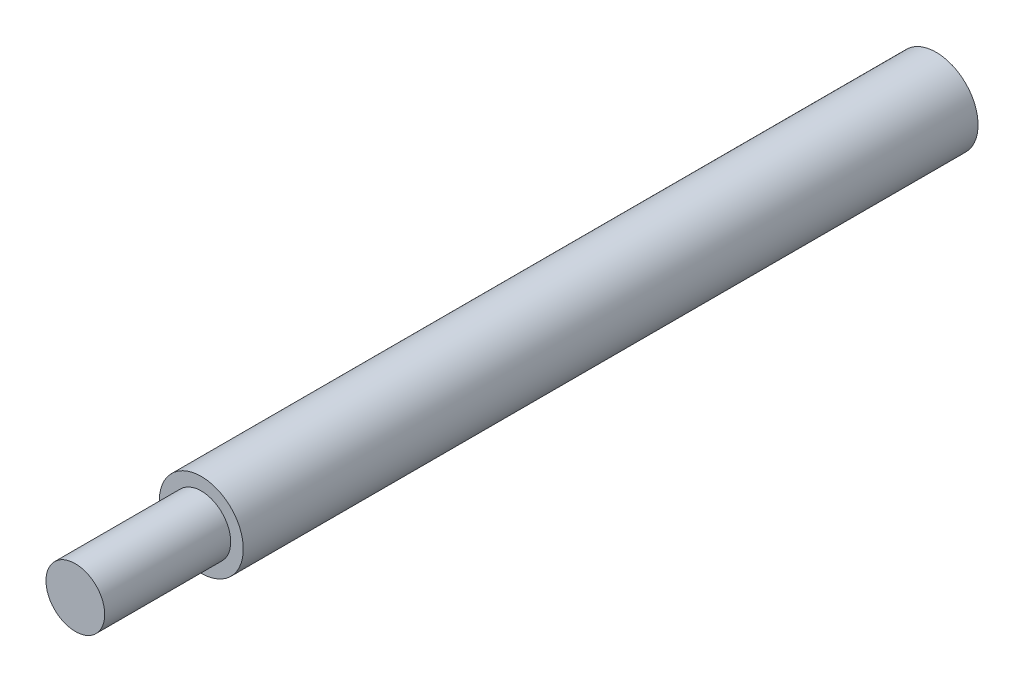
ISO-10303-21;
HEADER;
FILE_DESCRIPTION(('STEP AP214'),'2;1');
FILE_NAME('part.step','',(''),(''),'','','');
FILE_SCHEMA(('AUTOMOTIVE_DESIGN { 1 0 10303 214 1 1 1 1 }'));
ENDSEC;
DATA;
#1=APPLICATION_CONTEXT('core data for automotive mechanical design processes');
#2=APPLICATION_PROTOCOL_DEFINITION('international standard','automotive_design',2000,#1);
#3=PRODUCT_CONTEXT('',#1,'mechanical');
#4=PRODUCT('Part','Part','',(#3));
#5=PRODUCT_RELATED_PRODUCT_CATEGORY('part','',(#4));
#6=PRODUCT_DEFINITION_FORMATION('','',#4);
#7=PRODUCT_DEFINITION_CONTEXT('part definition',#1,'design');
#8=PRODUCT_DEFINITION('design','',#6,#7);
#9=PRODUCT_DEFINITION_SHAPE('','',#8);
#10=(LENGTH_UNIT() NAMED_UNIT(*) SI_UNIT(.MILLI.,.METRE.));
#11=(NAMED_UNIT(*) PLANE_ANGLE_UNIT() SI_UNIT($,.RADIAN.));
#12=(NAMED_UNIT(*) SI_UNIT($,.STERADIAN.) SOLID_ANGLE_UNIT());
#13=UNCERTAINTY_MEASURE_WITH_UNIT(LENGTH_MEASURE(1.E-05),#10,'distance_accuracy_value','');
#14=(GEOMETRIC_REPRESENTATION_CONTEXT(3) GLOBAL_UNCERTAINTY_ASSIGNED_CONTEXT((#13)) GLOBAL_UNIT_ASSIGNED_CONTEXT((#10,
#11,#12)) REPRESENTATION_CONTEXT('',''));
#15=CARTESIAN_POINT('',(0.,0.,0.));
#16=DIRECTION('',(0.,0.,1.));
#17=DIRECTION('',(1.,0.,0.));
#18=AXIS2_PLACEMENT_3D('',#15,#16,#17);
#19=CARTESIAN_POINT('',(0.,0.,6.));
#20=DIRECTION('',(0.,0.,-1.));
#21=DIRECTION('',(-1.,0.,0.));
#22=AXIS2_PLACEMENT_3D('',#19,#20,#21);
#23=CYLINDRICAL_SURFACE('',#22,1.4);
#24=CARTESIAN_POINT('',(0.,0.,6.));
#25=DIRECTION('',(0.,0.,1.));
#26=DIRECTION('',(1.,0.,0.));
#27=AXIS2_PLACEMENT_3D('',#24,#25,#26);
#28=CIRCLE('',#27,1.4);
#29=CARTESIAN_POINT('',(1.4,0.,6.));
#30=VERTEX_POINT('',#29);
#31=EDGE_CURVE('E10',#30,#30,#28,.T.);
#32=ORIENTED_EDGE('',*,*,#31,.F.);
#33=EDGE_LOOP('',(#32));
#34=FACE_BOUND('',#33,.T.);
#35=CARTESIAN_POINT('',(0.,0.,0.));
#36=DIRECTION('',(0.,0.,1.));
#37=DIRECTION('',(1.,0.,0.));
#38=AXIS2_PLACEMENT_3D('',#35,#36,#37);
#39=CIRCLE('',#38,1.4);
#40=CARTESIAN_POINT('',(1.4,0.,0.));
#41=VERTEX_POINT('',#40);
#42=EDGE_CURVE('E34',#41,#41,#39,.T.);
#43=ORIENTED_EDGE('',*,*,#42,.T.);
#44=EDGE_LOOP('',(#43));
#45=FACE_BOUND('',#44,.T.);
#46=ADVANCED_FACE('F31',(#34,#45),#23,.T.);
#47=CARTESIAN_POINT('',(0.,0.,6.));
#48=DIRECTION('',(0.,0.,1.));
#49=DIRECTION('',(1.,0.,0.));
#50=AXIS2_PLACEMENT_3D('',#47,#48,#49);
#51=PLANE('',#50);
#52=ORIENTED_EDGE('',*,*,#31,.T.);
#53=EDGE_LOOP('',(#52));
#54=FACE_BOUND('',#53,.T.);
#55=ADVANCED_FACE('F73',(#54),#51,.T.);
#56=CARTESIAN_POINT('',(0.,0.,-35.));
#57=DIRECTION('',(0.,0.,1.));
#58=DIRECTION('',(1.,0.,0.));
#59=AXIS2_PLACEMENT_3D('',#56,#57,#58);
#60=CYLINDRICAL_SURFACE('',#59,2.);
#61=CARTESIAN_POINT('',(0.,0.,-35.));
#62=DIRECTION('',(0.,0.,-1.));
#63=DIRECTION('',(-1.,0.,0.));
#64=AXIS2_PLACEMENT_3D('',#61,#62,#63);
#65=CIRCLE('',#64,2.);
#66=CARTESIAN_POINT('',(-2.,0.,-35.));
#67=VERTEX_POINT('',#66);
#68=EDGE_CURVE('E41',#67,#67,#65,.T.);
#69=ORIENTED_EDGE('',*,*,#68,.F.);
#70=EDGE_LOOP('',(#69));
#71=FACE_BOUND('',#70,.T.);
#72=CARTESIAN_POINT('',(0.,0.,0.));
#73=DIRECTION('',(0.,0.,-1.));
#74=DIRECTION('',(-1.,0.,0.));
#75=AXIS2_PLACEMENT_3D('',#72,#73,#74);
#76=CIRCLE('',#75,2.);
#77=CARTESIAN_POINT('',(-2.,0.,0.));
#78=VERTEX_POINT('',#77);
#79=EDGE_CURVE('E43',#78,#78,#76,.T.);
#80=ORIENTED_EDGE('',*,*,#79,.T.);
#81=EDGE_LOOP('',(#80));
#82=FACE_BOUND('',#81,.T.);
#83=ADVANCED_FACE('F67',(#71,#82),#60,.T.);
#84=CARTESIAN_POINT('',(0.,0.,-35.));
#85=DIRECTION('',(0.,0.,-1.));
#86=DIRECTION('',(-1.,0.,0.));
#87=AXIS2_PLACEMENT_3D('',#84,#85,#86);
#88=PLANE('',#87);
#89=CARTESIAN_POINT('',(0.,0.,-35.));
#90=DIRECTION('',(0.,0.,-1.));
#91=DIRECTION('',(-1.,0.,0.));
#92=AXIS2_PLACEMENT_3D('',#89,#90,#91);
#93=CIRCLE('',#92,1.4);
#94=CARTESIAN_POINT('',(-1.4,0.,-35.));
#95=VERTEX_POINT('',#94);
#96=EDGE_CURVE('E49',#95,#95,#93,.T.);
#97=ORIENTED_EDGE('',*,*,#96,.F.);
#98=EDGE_LOOP('',(#97));
#99=FACE_BOUND('',#98,.T.);
#100=ORIENTED_EDGE('',*,*,#68,.T.);
#101=EDGE_LOOP('',(#100));
#102=FACE_BOUND('',#101,.T.);
#103=ADVANCED_FACE('F64',(#99,#102),#88,.T.);
#104=CARTESIAN_POINT('',(0.,0.,0.));
#105=DIRECTION('',(0.,0.,-1.));
#106=DIRECTION('',(-1.,0.,0.));
#107=AXIS2_PLACEMENT_3D('',#104,#105,#106);
#108=PLANE('',#107);
#109=ORIENTED_EDGE('',*,*,#42,.F.);
#110=EDGE_LOOP('',(#109));
#111=FACE_BOUND('',#110,.T.);
#112=ORIENTED_EDGE('',*,*,#79,.F.);
#113=EDGE_LOOP('',(#112));
#114=FACE_BOUND('',#113,.T.);
#115=ADVANCED_FACE('F60',(#111,#114),#108,.F.);
#116=CARTESIAN_POINT('',(0.,0.,-25.));
#117=DIRECTION('',(0.,0.,-1.));
#118=DIRECTION('',(-1.,0.,0.));
#119=AXIS2_PLACEMENT_3D('',#116,#117,#118);
#120=CYLINDRICAL_SURFACE('',#119,1.4);
#121=CARTESIAN_POINT('',(0.,0.,-25.));
#122=DIRECTION('',(0.,0.,-1.));
#123=DIRECTION('',(-1.,0.,0.));
#124=AXIS2_PLACEMENT_3D('',#121,#122,#123);
#125=CIRCLE('',#124,1.4);
#126=CARTESIAN_POINT('',(-1.4,0.,-25.));
#127=VERTEX_POINT('',#126);
#128=EDGE_CURVE('E46',#127,#127,#125,.T.);
#129=ORIENTED_EDGE('',*,*,#128,.F.);
#130=EDGE_LOOP('',(#129));
#131=FACE_BOUND('',#130,.T.);
#132=ORIENTED_EDGE('',*,*,#96,.T.);
#133=EDGE_LOOP('',(#132));
#134=FACE_BOUND('',#133,.T.);
#135=ADVANCED_FACE('F57',(#131,#134),#120,.F.);
#136=CARTESIAN_POINT('',(0.,0.,-25.));
#137=DIRECTION('',(0.,0.,-1.));
#138=DIRECTION('',(-1.,0.,0.));
#139=AXIS2_PLACEMENT_3D('',#136,#137,#138);
#140=PLANE('',#139);
#141=ORIENTED_EDGE('',*,*,#128,.T.);
#142=EDGE_LOOP('',(#141));
#143=FACE_BOUND('',#142,.T.);
#144=ADVANCED_FACE('F55',(#143),#140,.T.);
#145=CLOSED_SHELL('',(#46,#55,#83,#103,#115,#135,#144));
#146=MANIFOLD_SOLID_BREP('B2',#145);
#147=ADVANCED_BREP_SHAPE_REPRESENTATION('',(#18,#146),#14);
#148=SHAPE_DEFINITION_REPRESENTATION(#9,#147);
ENDSEC;
END-ISO-10303-21;
